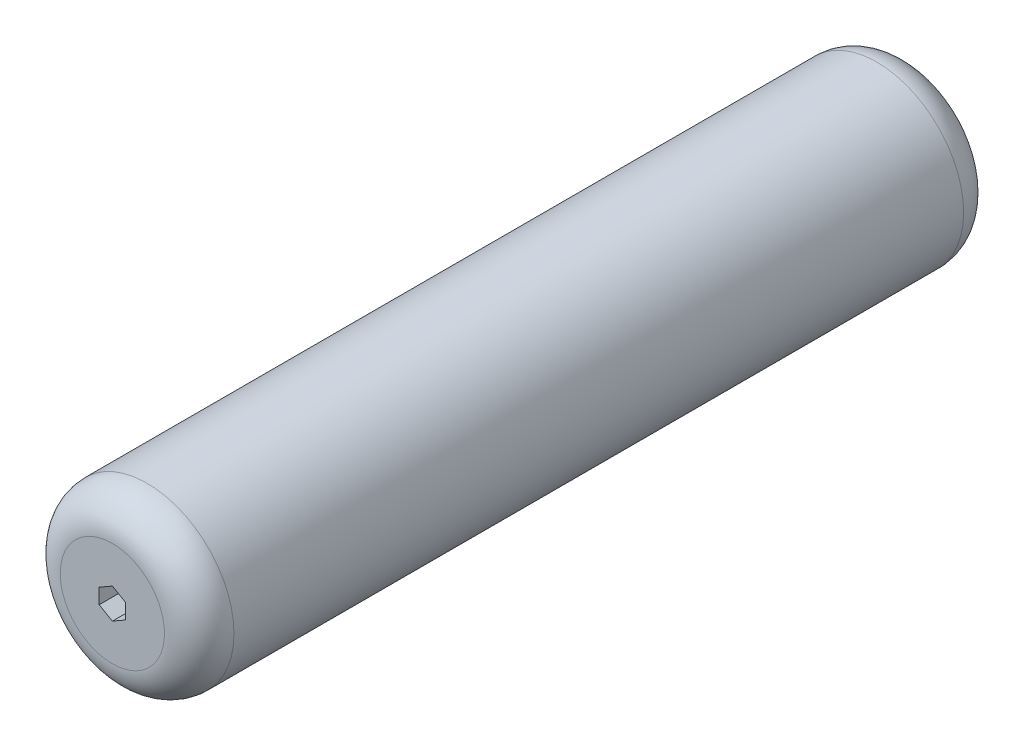
ISO-10303-21;
HEADER;
FILE_DESCRIPTION(('STEP AP214'),'2;1');
FILE_NAME('part.step','',(''),(''),'','','');
FILE_SCHEMA(('AUTOMOTIVE_DESIGN { 1 0 10303 214 1 1 1 1 }'));
ENDSEC;
DATA;
#1=APPLICATION_CONTEXT('core data for automotive mechanical design processes');
#2=APPLICATION_PROTOCOL_DEFINITION('international standard','automotive_design',2000,#1);
#3=PRODUCT_CONTEXT('',#1,'mechanical');
#4=PRODUCT('Part','Part','',(#3));
#5=PRODUCT_RELATED_PRODUCT_CATEGORY('part','',(#4));
#6=PRODUCT_DEFINITION_FORMATION('','',#4);
#7=PRODUCT_DEFINITION_CONTEXT('part definition',#1,'design');
#8=PRODUCT_DEFINITION('design','',#6,#7);
#9=PRODUCT_DEFINITION_SHAPE('','',#8);
#10=(LENGTH_UNIT() NAMED_UNIT(*) SI_UNIT(.MILLI.,.METRE.));
#11=(NAMED_UNIT(*) PLANE_ANGLE_UNIT() SI_UNIT($,.RADIAN.));
#12=(NAMED_UNIT(*) SI_UNIT($,.STERADIAN.) SOLID_ANGLE_UNIT());
#13=UNCERTAINTY_MEASURE_WITH_UNIT(LENGTH_MEASURE(1.E-05),#10,'distance_accuracy_value','');
#14=(GEOMETRIC_REPRESENTATION_CONTEXT(3) GLOBAL_UNCERTAINTY_ASSIGNED_CONTEXT((#13)) GLOBAL_UNIT_ASSIGNED_CONTEXT((#10,
#11,#12)) REPRESENTATION_CONTEXT('',''));
#15=CARTESIAN_POINT('',(0.,0.,0.));
#16=DIRECTION('',(0.,0.,1.));
#17=DIRECTION('',(1.,0.,0.));
#18=AXIS2_PLACEMENT_3D('',#15,#16,#17);
#19=CARTESIAN_POINT('',(0.,0.,292.1));
#20=DIRECTION('',(0.,0.,1.));
#21=DIRECTION('',(1.,0.,0.));
#22=AXIS2_PLACEMENT_3D('',#19,#20,#21);
#23=PLANE('',#22);
#24=CARTESIAN_POINT('',(0.,0.,292.1));
#25=DIRECTION('',(0.,0.,1.));
#26=DIRECTION('',(1.,0.,0.));
#27=AXIS2_PLACEMENT_3D('',#24,#25,#26);
#28=CIRCLE('',#27,19.05);
#29=CARTESIAN_POINT('',(19.05,0.,292.1));
#30=VERTEX_POINT('',#29);
#31=EDGE_CURVE('E102',#30,#30,#28,.T.);
#32=ORIENTED_EDGE('',*,*,#31,.T.);
#33=EDGE_LOOP('',(#32));
#34=FACE_BOUND('',#33,.T.);
#35=DIRECTION('',(0.866025403784438,0.5,0.));
#36=VECTOR('',#35,1.);
#37=CARTESIAN_POINT('',(0.,-5.55625,292.1));
#38=LINE('',#37,#36);
#39=CARTESIAN_POINT('',(0.,-5.55625,292.1));
#40=VERTEX_POINT('',#39);
#41=CARTESIAN_POINT('',(4.81185364977728,-2.778125,292.1));
#42=VERTEX_POINT('',#41);
#43=EDGE_CURVE('E94',#40,#42,#38,.T.);
#44=ORIENTED_EDGE('',*,*,#43,.F.);
#45=DIRECTION('',(0.866025403784438,-0.5,0.));
#46=VECTOR('',#45,1.);
#47=CARTESIAN_POINT('',(-4.81185364977729,-2.778125,292.1));
#48=LINE('',#47,#46);
#49=CARTESIAN_POINT('',(-4.81185364977729,-2.778125,292.1));
#50=VERTEX_POINT('',#49);
#51=EDGE_CURVE('E86',#50,#40,#48,.T.);
#52=ORIENTED_EDGE('',*,*,#51,.F.);
#53=DIRECTION('',(0.,-1.,0.));
#54=VECTOR('',#53,1.);
#55=CARTESIAN_POINT('',(-4.81185364977729,2.778125,292.1));
#56=LINE('',#55,#54);
#57=CARTESIAN_POINT('',(-4.81185364977729,2.778125,292.1));
#58=VERTEX_POINT('',#57);
#59=EDGE_CURVE('E115',#58,#50,#56,.T.);
#60=ORIENTED_EDGE('',*,*,#59,.F.);
#61=DIRECTION('',(-0.866025403784438,-0.5,0.));
#62=VECTOR('',#61,1.);
#63=CARTESIAN_POINT('',(0.,5.55625,292.1));
#64=LINE('',#63,#62);
#65=CARTESIAN_POINT('',(0.,5.55625,292.1));
#66=VERTEX_POINT('',#65);
#67=EDGE_CURVE('E113',#66,#58,#64,.T.);
#68=ORIENTED_EDGE('',*,*,#67,.F.);
#69=DIRECTION('',(-0.866025403784439,0.5,0.));
#70=VECTOR('',#69,1.);
#71=CARTESIAN_POINT('',(4.81185364977728,2.778125,292.1));
#72=LINE('',#71,#70);
#73=CARTESIAN_POINT('',(4.81185364977728,2.778125,292.1));
#74=VERTEX_POINT('',#73);
#75=EDGE_CURVE('E109',#74,#66,#72,.T.);
#76=ORIENTED_EDGE('',*,*,#75,.F.);
#77=DIRECTION('',(0.,1.,0.));
#78=VECTOR('',#77,1.);
#79=CARTESIAN_POINT('',(4.81185364977728,-2.778125,292.1));
#80=LINE('',#79,#78);
#81=EDGE_CURVE('E107',#42,#74,#80,.T.);
#82=ORIENTED_EDGE('',*,*,#81,.F.);
#83=EDGE_LOOP('',(#44,#52,#60,#68,#76,#82));
#84=FACE_BOUND('',#83,.T.);
#85=ADVANCED_FACE('F33',(#34,#84),#23,.T.);
#86=CARTESIAN_POINT('',(0.,0.,0.));
#87=DIRECTION('',(0.,0.,1.));
#88=DIRECTION('',(1.,0.,0.));
#89=AXIS2_PLACEMENT_3D('',#86,#87,#88);
#90=PLANE('',#89);
#91=CARTESIAN_POINT('',(0.,0.,0.));
#92=DIRECTION('',(0.,0.,1.));
#93=DIRECTION('',(1.,0.,0.));
#94=AXIS2_PLACEMENT_3D('',#91,#92,#93);
#95=CIRCLE('',#94,19.05);
#96=CARTESIAN_POINT('',(19.05,0.,0.));
#97=VERTEX_POINT('',#96);
#98=EDGE_CURVE('E11',#97,#97,#95,.F.);
#99=ORIENTED_EDGE('',*,*,#98,.T.);
#100=EDGE_LOOP('',(#99));
#101=FACE_BOUND('',#100,.T.);
#102=DIRECTION('',(0.866025403784438,-0.5,0.));
#103=VECTOR('',#102,1.);
#104=CARTESIAN_POINT('',(-4.81185364977729,-2.778125,0.));
#105=LINE('',#104,#103);
#106=CARTESIAN_POINT('',(-4.81185364977729,-2.778125,0.));
#107=VERTEX_POINT('',#106);
#108=CARTESIAN_POINT('',(0.,-5.55625,0.));
#109=VERTEX_POINT('',#108);
#110=EDGE_CURVE('E56',#107,#109,#105,.T.);
#111=ORIENTED_EDGE('',*,*,#110,.T.);
#112=DIRECTION('',(0.866025403784438,0.5,0.));
#113=VECTOR('',#112,1.);
#114=CARTESIAN_POINT('',(0.,-5.55625,0.));
#115=LINE('',#114,#113);
#116=CARTESIAN_POINT('',(4.81185364977728,-2.778125,0.));
#117=VERTEX_POINT('',#116);
#118=EDGE_CURVE('E101',#109,#117,#115,.T.);
#119=ORIENTED_EDGE('',*,*,#118,.T.);
#120=DIRECTION('',(0.,1.,0.));
#121=VECTOR('',#120,1.);
#122=CARTESIAN_POINT('',(4.81185364977728,-2.778125,0.));
#123=LINE('',#122,#121);
#124=CARTESIAN_POINT('',(4.81185364977728,2.778125,0.));
#125=VERTEX_POINT('',#124);
#126=EDGE_CURVE('E119',#117,#125,#123,.T.);
#127=ORIENTED_EDGE('',*,*,#126,.T.);
#128=DIRECTION('',(-0.866025403784439,0.5,0.));
#129=VECTOR('',#128,1.);
#130=CARTESIAN_POINT('',(4.81185364977728,2.778125,0.));
#131=LINE('',#130,#129);
#132=CARTESIAN_POINT('',(0.,5.55625,0.));
#133=VERTEX_POINT('',#132);
#134=EDGE_CURVE('E122',#125,#133,#131,.T.);
#135=ORIENTED_EDGE('',*,*,#134,.T.);
#136=DIRECTION('',(-0.866025403784438,-0.5,0.));
#137=VECTOR('',#136,1.);
#138=CARTESIAN_POINT('',(0.,5.55625,0.));
#139=LINE('',#138,#137);
#140=CARTESIAN_POINT('',(-4.81185364977729,2.778125,0.));
#141=VERTEX_POINT('',#140);
#142=EDGE_CURVE('E125',#133,#141,#139,.T.);
#143=ORIENTED_EDGE('',*,*,#142,.T.);
#144=DIRECTION('',(0.,-1.,0.));
#145=VECTOR('',#144,1.);
#146=CARTESIAN_POINT('',(-4.81185364977729,2.778125,0.));
#147=LINE('',#146,#145);
#148=EDGE_CURVE('E95',#141,#107,#147,.T.);
#149=ORIENTED_EDGE('',*,*,#148,.T.);
#150=EDGE_LOOP('',(#111,#119,#127,#135,#143,#149));
#151=FACE_BOUND('',#150,.T.);
#152=ADVANCED_FACE('F157',(#101,#151),#90,.F.);
#153=CARTESIAN_POINT('',(0.,0.,292.1));
#154=DIRECTION('',(0.,0.,-1.));
#155=DIRECTION('',(-1.,0.,0.));
#156=AXIS2_PLACEMENT_3D('',#153,#154,#155);
#157=CYLINDRICAL_SURFACE('',#156,31.75);
#158=CARTESIAN_POINT('',(0.,0.,12.7));
#159=DIRECTION('',(0.,0.,1.));
#160=DIRECTION('',(1.,0.,0.));
#161=AXIS2_PLACEMENT_3D('',#158,#159,#160);
#162=CIRCLE('',#161,31.75);
#163=CARTESIAN_POINT('',(31.75,0.,12.7));
#164=VERTEX_POINT('',#163);
#165=EDGE_CURVE('E41',#164,#164,#162,.T.);
#166=ORIENTED_EDGE('',*,*,#165,.T.);
#167=EDGE_LOOP('',(#166));
#168=FACE_BOUND('',#167,.T.);
#169=CARTESIAN_POINT('',(0.,0.,279.4));
#170=DIRECTION('',(0.,0.,1.));
#171=DIRECTION('',(1.,0.,0.));
#172=AXIS2_PLACEMENT_3D('',#169,#170,#171);
#173=CIRCLE('',#172,31.75);
#174=CARTESIAN_POINT('',(31.75,0.,279.4));
#175=VERTEX_POINT('',#174);
#176=EDGE_CURVE('E139',#175,#175,#173,.F.);
#177=ORIENTED_EDGE('',*,*,#176,.T.);
#178=EDGE_LOOP('',(#177));
#179=FACE_BOUND('',#178,.T.);
#180=ADVANCED_FACE('F144',(#168,#179),#157,.T.);
#181=CARTESIAN_POINT('',(-4.81185364977729,-2.778125,292.1));
#182=DIRECTION('',(0.5,0.866025403784438,0.));
#183=DIRECTION('',(-0.866025403784438,0.5,0.));
#184=AXIS2_PLACEMENT_3D('',#181,#182,#183);
#185=PLANE('',#184);
#186=ORIENTED_EDGE('',*,*,#110,.F.);
#187=DIRECTION('',(0.,0.,-1.));
#188=VECTOR('',#187,1.);
#189=CARTESIAN_POINT('',(-4.81185364977729,-2.778125,292.1));
#190=LINE('',#189,#188);
#191=EDGE_CURVE('E90',#50,#107,#190,.T.);
#192=ORIENTED_EDGE('',*,*,#191,.F.);
#193=ORIENTED_EDGE('',*,*,#51,.T.);
#194=DIRECTION('',(0.,0.,-1.));
#195=VECTOR('',#194,1.);
#196=CARTESIAN_POINT('',(0.,-5.55625,292.1));
#197=LINE('',#196,#195);
#198=EDGE_CURVE('E89',#40,#109,#197,.T.);
#199=ORIENTED_EDGE('',*,*,#198,.T.);
#200=EDGE_LOOP('',(#186,#192,#193,#199));
#201=FACE_BOUND('',#200,.T.);
#202=ADVANCED_FACE('F88',(#201),#185,.T.);
#203=CARTESIAN_POINT('',(0.,-5.55625,292.1));
#204=DIRECTION('',(-0.5,0.866025403784439,0.));
#205=DIRECTION('',(-0.866025403784439,-0.5,0.));
#206=AXIS2_PLACEMENT_3D('',#203,#204,#205);
#207=PLANE('',#206);
#208=ORIENTED_EDGE('',*,*,#118,.F.);
#209=ORIENTED_EDGE('',*,*,#198,.F.);
#210=ORIENTED_EDGE('',*,*,#43,.T.);
#211=DIRECTION('',(0.,0.,-1.));
#212=VECTOR('',#211,1.);
#213=CARTESIAN_POINT('',(4.81185364977728,-2.778125,292.1));
#214=LINE('',#213,#212);
#215=EDGE_CURVE('E103',#42,#117,#214,.T.);
#216=ORIENTED_EDGE('',*,*,#215,.T.);
#217=EDGE_LOOP('',(#208,#209,#210,#216));
#218=FACE_BOUND('',#217,.T.);
#219=ADVANCED_FACE('F98',(#218),#207,.T.);
#220=CARTESIAN_POINT('',(4.81185364977728,-2.778125,292.1));
#221=DIRECTION('',(-1.,0.,0.));
#222=DIRECTION('',(0.,0.,1.));
#223=AXIS2_PLACEMENT_3D('',#220,#221,#222);
#224=PLANE('',#223);
#225=ORIENTED_EDGE('',*,*,#126,.F.);
#226=ORIENTED_EDGE('',*,*,#215,.F.);
#227=ORIENTED_EDGE('',*,*,#81,.T.);
#228=DIRECTION('',(0.,0.,-1.));
#229=VECTOR('',#228,1.);
#230=CARTESIAN_POINT('',(4.81185364977728,2.778125,292.1));
#231=LINE('',#230,#229);
#232=EDGE_CURVE('E134',#74,#125,#231,.T.);
#233=ORIENTED_EDGE('',*,*,#232,.T.);
#234=EDGE_LOOP('',(#225,#226,#227,#233));
#235=FACE_BOUND('',#234,.T.);
#236=ADVANCED_FACE('F175',(#235),#224,.T.);
#237=CARTESIAN_POINT('',(4.81185364977728,2.778125,292.1));
#238=DIRECTION('',(-0.5,-0.866025403784439,0.));
#239=DIRECTION('',(0.866025403784439,-0.5,0.));
#240=AXIS2_PLACEMENT_3D('',#237,#238,#239);
#241=PLANE('',#240);
#242=ORIENTED_EDGE('',*,*,#134,.F.);
#243=ORIENTED_EDGE('',*,*,#232,.F.);
#244=ORIENTED_EDGE('',*,*,#75,.T.);
#245=DIRECTION('',(0.,0.,-1.));
#246=VECTOR('',#245,1.);
#247=CARTESIAN_POINT('',(0.,5.55625,292.1));
#248=LINE('',#247,#246);
#249=EDGE_CURVE('E132',#66,#133,#248,.T.);
#250=ORIENTED_EDGE('',*,*,#249,.T.);
#251=EDGE_LOOP('',(#242,#243,#244,#250));
#252=FACE_BOUND('',#251,.T.);
#253=ADVANCED_FACE('F179',(#252),#241,.T.);
#254=CARTESIAN_POINT('',(0.,5.55625,292.1));
#255=DIRECTION('',(0.5,-0.866025403784439,0.));
#256=DIRECTION('',(0.866025403784439,0.5,0.));
#257=AXIS2_PLACEMENT_3D('',#254,#255,#256);
#258=PLANE('',#257);
#259=ORIENTED_EDGE('',*,*,#142,.F.);
#260=ORIENTED_EDGE('',*,*,#249,.F.);
#261=ORIENTED_EDGE('',*,*,#67,.T.);
#262=DIRECTION('',(0.,0.,-1.));
#263=VECTOR('',#262,1.);
#264=CARTESIAN_POINT('',(-4.81185364977729,2.778125,292.1));
#265=LINE('',#264,#263);
#266=EDGE_CURVE('E48',#58,#141,#265,.T.);
#267=ORIENTED_EDGE('',*,*,#266,.T.);
#268=EDGE_LOOP('',(#259,#260,#261,#267));
#269=FACE_BOUND('',#268,.T.);
#270=ADVANCED_FACE('F185',(#269),#258,.T.);
#271=CARTESIAN_POINT('',(-4.81185364977729,2.778125,292.1));
#272=DIRECTION('',(1.,0.,0.));
#273=DIRECTION('',(0.,0.,-1.));
#274=AXIS2_PLACEMENT_3D('',#271,#272,#273);
#275=PLANE('',#274);
#276=ORIENTED_EDGE('',*,*,#148,.F.);
#277=ORIENTED_EDGE('',*,*,#266,.F.);
#278=ORIENTED_EDGE('',*,*,#59,.T.);
#279=ORIENTED_EDGE('',*,*,#191,.T.);
#280=EDGE_LOOP('',(#276,#277,#278,#279));
#281=FACE_BOUND('',#280,.T.);
#282=ADVANCED_FACE('F153',(#281),#275,.T.);
#283=CARTESIAN_POINT('',(0.,0.,279.4));
#284=DIRECTION('',(0.,0.,1.));
#285=DIRECTION('',(1.,0.,0.));
#286=AXIS2_PLACEMENT_3D('',#283,#284,#285);
#287=TOROIDAL_SURFACE('',#286,19.05,12.7);
#288=ORIENTED_EDGE('',*,*,#176,.F.);
#289=EDGE_LOOP('',(#288));
#290=FACE_BOUND('',#289,.T.);
#291=ORIENTED_EDGE('',*,*,#31,.F.);
#292=EDGE_LOOP('',(#291));
#293=FACE_BOUND('',#292,.T.);
#294=ADVANCED_FACE('F148',(#290,#293),#287,.T.);
#295=CARTESIAN_POINT('',(0.,0.,12.7));
#296=DIRECTION('',(0.,0.,1.));
#297=DIRECTION('',(1.,0.,0.));
#298=AXIS2_PLACEMENT_3D('',#295,#296,#297);
#299=TOROIDAL_SURFACE('',#298,19.05,12.7);
#300=ORIENTED_EDGE('',*,*,#98,.F.);
#301=EDGE_LOOP('',(#300));
#302=FACE_BOUND('',#301,.T.);
#303=ORIENTED_EDGE('',*,*,#165,.F.);
#304=EDGE_LOOP('',(#303));
#305=FACE_BOUND('',#304,.T.);
#306=ADVANCED_FACE('F35',(#302,#305),#299,.T.);
#307=CLOSED_SHELL('',(#85,#152,#180,#202,#219,#236,#253,#270,#282,#294,#306));
#308=MANIFOLD_SOLID_BREP('B2',#307);
#309=ADVANCED_BREP_SHAPE_REPRESENTATION('',(#18,#308),#14);
#310=SHAPE_DEFINITION_REPRESENTATION(#9,#309);
ENDSEC;
END-ISO-10303-21;
